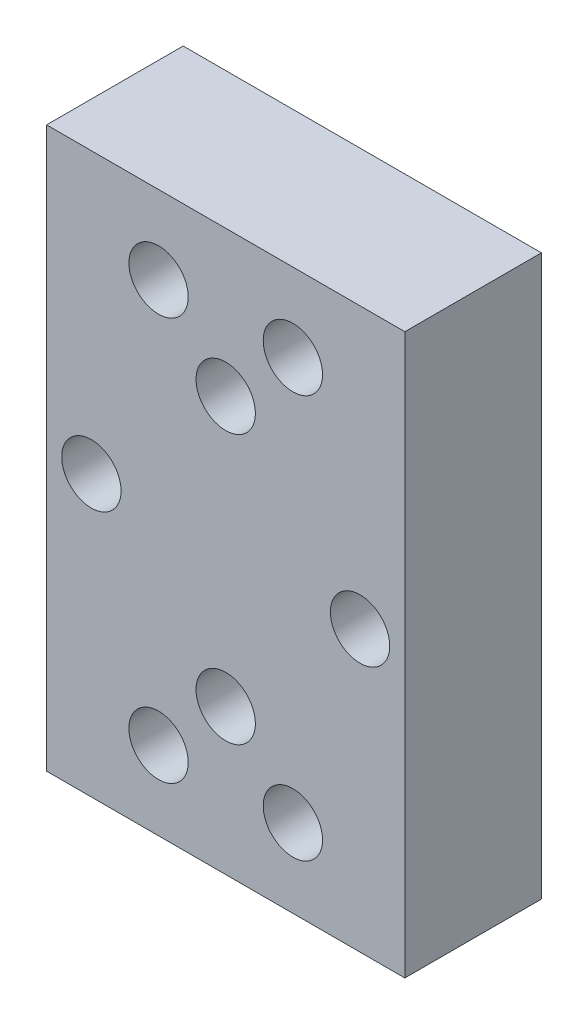
ISO-10303-21;
HEADER;
FILE_DESCRIPTION(('STEP AP214'),'2;1');
FILE_NAME('part.step','',(''),(''),'','','');
FILE_SCHEMA(('AUTOMOTIVE_DESIGN { 1 0 10303 214 1 1 1 1 }'));
ENDSEC;
DATA;
#1=APPLICATION_CONTEXT('core data for automotive mechanical design processes');
#2=APPLICATION_PROTOCOL_DEFINITION('international standard','automotive_design',2000,#1);
#3=PRODUCT_CONTEXT('',#1,'mechanical');
#4=PRODUCT('Part','Part','',(#3));
#5=PRODUCT_RELATED_PRODUCT_CATEGORY('part','',(#4));
#6=PRODUCT_DEFINITION_FORMATION('','',#4);
#7=PRODUCT_DEFINITION_CONTEXT('part definition',#1,'design');
#8=PRODUCT_DEFINITION('design','',#6,#7);
#9=PRODUCT_DEFINITION_SHAPE('','',#8);
#10=(LENGTH_UNIT() NAMED_UNIT(*) SI_UNIT(.MILLI.,.METRE.));
#11=(NAMED_UNIT(*) PLANE_ANGLE_UNIT() SI_UNIT($,.RADIAN.));
#12=(NAMED_UNIT(*) SI_UNIT($,.STERADIAN.) SOLID_ANGLE_UNIT());
#13=UNCERTAINTY_MEASURE_WITH_UNIT(LENGTH_MEASURE(1.E-05),#10,'distance_accuracy_value','');
#14=(GEOMETRIC_REPRESENTATION_CONTEXT(3) GLOBAL_UNCERTAINTY_ASSIGNED_CONTEXT((#13)) GLOBAL_UNIT_ASSIGNED_CONTEXT((#10,
#11,#12)) REPRESENTATION_CONTEXT('',''));
#15=CARTESIAN_POINT('',(0.,0.,0.));
#16=DIRECTION('',(0.,0.,1.));
#17=DIRECTION('',(1.,0.,0.));
#18=AXIS2_PLACEMENT_3D('',#15,#16,#17);
#19=CARTESIAN_POINT('',(0.,0.,6.1));
#20=DIRECTION('',(0.,0.,-1.));
#21=DIRECTION('',(-1.,0.,0.));
#22=AXIS2_PLACEMENT_3D('',#19,#20,#21);
#23=PLANE('',#22);
#24=DIRECTION('',(0.,-1.,0.));
#25=VECTOR('',#24,1.);
#26=CARTESIAN_POINT('',(0.,0.,6.1));
#27=LINE('',#26,#25);
#28=CARTESIAN_POINT('',(0.,25.,6.1));
#29=VERTEX_POINT('',#28);
#30=CARTESIAN_POINT('',(0.,0.,6.1));
#31=VERTEX_POINT('',#30);
#32=EDGE_CURVE('E98',#29,#31,#27,.T.);
#33=ORIENTED_EDGE('',*,*,#32,.T.);
#34=DIRECTION('',(1.,0.,0.));
#35=VECTOR('',#34,1.);
#36=CARTESIAN_POINT('',(0.,0.,6.1));
#37=LINE('',#36,#35);
#38=CARTESIAN_POINT('',(16.,0.,6.1));
#39=VERTEX_POINT('',#38);
#40=EDGE_CURVE('E93',#31,#39,#37,.T.);
#41=ORIENTED_EDGE('',*,*,#40,.T.);
#42=DIRECTION('',(0.,1.,0.));
#43=VECTOR('',#42,1.);
#44=CARTESIAN_POINT('',(16.,0.,6.1));
#45=LINE('',#44,#43);
#46=CARTESIAN_POINT('',(16.,25.,6.1));
#47=VERTEX_POINT('',#46);
#48=EDGE_CURVE('E96',#39,#47,#45,.T.);
#49=ORIENTED_EDGE('',*,*,#48,.T.);
#50=DIRECTION('',(-1.,0.,0.));
#51=VECTOR('',#50,1.);
#52=CARTESIAN_POINT('',(0.,25.,6.1));
#53=LINE('',#52,#51);
#54=EDGE_CURVE('E63',#47,#29,#53,.T.);
#55=ORIENTED_EDGE('',*,*,#54,.T.);
#56=EDGE_LOOP('',(#33,#41,#49,#55));
#57=FACE_BOUND('',#56,.T.);
#58=CARTESIAN_POINT('',(2.,12.5,6.1));
#59=DIRECTION('',(0.,0.,1.));
#60=DIRECTION('',(1.,0.,0.));
#61=AXIS2_PLACEMENT_3D('',#58,#59,#60);
#62=CIRCLE('',#61,1.325);
#63=CARTESIAN_POINT('',(3.325,12.5,6.1));
#64=VERTEX_POINT('',#63);
#65=EDGE_CURVE('E118',#64,#64,#62,.T.);
#66=ORIENTED_EDGE('',*,*,#65,.F.);
#67=EDGE_LOOP('',(#66));
#68=FACE_BOUND('',#67,.T.);
#69=CARTESIAN_POINT('',(8.,18.5,6.1));
#70=DIRECTION('',(0.,0.,1.));
#71=DIRECTION('',(1.,0.,0.));
#72=AXIS2_PLACEMENT_3D('',#69,#70,#71);
#73=CIRCLE('',#72,1.325);
#74=CARTESIAN_POINT('',(9.325,18.5,6.1));
#75=VERTEX_POINT('',#74);
#76=EDGE_CURVE('E140',#75,#75,#73,.T.);
#77=ORIENTED_EDGE('',*,*,#76,.F.);
#78=EDGE_LOOP('',(#77));
#79=FACE_BOUND('',#78,.T.);
#80=CARTESIAN_POINT('',(5.,21.5,6.1));
#81=DIRECTION('',(0.,0.,1.));
#82=DIRECTION('',(1.,0.,0.));
#83=AXIS2_PLACEMENT_3D('',#80,#81,#82);
#84=CIRCLE('',#83,1.325);
#85=CARTESIAN_POINT('',(6.325,21.5,6.1));
#86=VERTEX_POINT('',#85);
#87=EDGE_CURVE('E148',#86,#86,#84,.T.);
#88=ORIENTED_EDGE('',*,*,#87,.F.);
#89=EDGE_LOOP('',(#88));
#90=FACE_BOUND('',#89,.T.);
#91=CARTESIAN_POINT('',(14.,12.5,6.1));
#92=DIRECTION('',(0.,0.,1.));
#93=DIRECTION('',(-1.,0.,0.));
#94=AXIS2_PLACEMENT_3D('',#91,#92,#93);
#95=CIRCLE('',#94,1.325);
#96=CARTESIAN_POINT('',(12.675,12.5,6.1));
#97=VERTEX_POINT('',#96);
#98=EDGE_CURVE('E156',#97,#97,#95,.T.);
#99=ORIENTED_EDGE('',*,*,#98,.F.);
#100=EDGE_LOOP('',(#99));
#101=FACE_BOUND('',#100,.T.);
#102=CARTESIAN_POINT('',(11.,21.5,6.1));
#103=DIRECTION('',(0.,0.,1.));
#104=DIRECTION('',(-1.,0.,0.));
#105=AXIS2_PLACEMENT_3D('',#102,#103,#104);
#106=CIRCLE('',#105,1.325);
#107=CARTESIAN_POINT('',(9.675,21.5,6.1));
#108=VERTEX_POINT('',#107);
#109=EDGE_CURVE('E164',#108,#108,#106,.T.);
#110=ORIENTED_EDGE('',*,*,#109,.F.);
#111=EDGE_LOOP('',(#110));
#112=FACE_BOUND('',#111,.T.);
#113=CARTESIAN_POINT('',(5.,3.5,6.1));
#114=DIRECTION('',(0.,0.,1.));
#115=DIRECTION('',(-1.,0.,0.));
#116=AXIS2_PLACEMENT_3D('',#113,#114,#115);
#117=CIRCLE('',#116,1.325);
#118=CARTESIAN_POINT('',(3.675,3.5,6.1));
#119=VERTEX_POINT('',#118);
#120=EDGE_CURVE('E172',#119,#119,#117,.T.);
#121=ORIENTED_EDGE('',*,*,#120,.F.);
#122=EDGE_LOOP('',(#121));
#123=FACE_BOUND('',#122,.T.);
#124=CARTESIAN_POINT('',(11.,3.5,6.1));
#125=DIRECTION('',(0.,0.,1.));
#126=DIRECTION('',(1.,0.,0.));
#127=AXIS2_PLACEMENT_3D('',#124,#125,#126);
#128=CIRCLE('',#127,1.325);
#129=CARTESIAN_POINT('',(12.325,3.5,6.1));
#130=VERTEX_POINT('',#129);
#131=EDGE_CURVE('E180',#130,#130,#128,.T.);
#132=ORIENTED_EDGE('',*,*,#131,.F.);
#133=EDGE_LOOP('',(#132));
#134=FACE_BOUND('',#133,.T.);
#135=CARTESIAN_POINT('',(8.,6.5,6.1));
#136=DIRECTION('',(0.,0.,1.));
#137=DIRECTION('',(-1.,0.,0.));
#138=AXIS2_PLACEMENT_3D('',#135,#136,#137);
#139=CIRCLE('',#138,1.325);
#140=CARTESIAN_POINT('',(6.675,6.5,6.1));
#141=VERTEX_POINT('',#140);
#142=EDGE_CURVE('E188',#141,#141,#139,.T.);
#143=ORIENTED_EDGE('',*,*,#142,.F.);
#144=EDGE_LOOP('',(#143));
#145=FACE_BOUND('',#144,.T.);
#146=ADVANCED_FACE('F45',(#57,#68,#79,#90,#101,#112,#123,#134,#145),#23,.F.);
#147=CARTESIAN_POINT('',(0.,0.,0.));
#148=DIRECTION('',(0.,0.,-1.));
#149=DIRECTION('',(-1.,0.,0.));
#150=AXIS2_PLACEMENT_3D('',#147,#148,#149);
#151=PLANE('',#150);
#152=CARTESIAN_POINT('',(11.,3.5,0.));
#153=DIRECTION('',(0.,0.,1.));
#154=DIRECTION('',(1.,0.,0.));
#155=AXIS2_PLACEMENT_3D('',#152,#153,#154);
#156=CIRCLE('',#155,1.325);
#157=CARTESIAN_POINT('',(12.325,3.5,0.));
#158=VERTEX_POINT('',#157);
#159=EDGE_CURVE('E184',#158,#158,#156,.T.);
#160=ORIENTED_EDGE('',*,*,#159,.T.);
#161=EDGE_LOOP('',(#160));
#162=FACE_BOUND('',#161,.T.);
#163=CARTESIAN_POINT('',(11.,21.5,0.));
#164=DIRECTION('',(0.,0.,1.));
#165=DIRECTION('',(-1.,0.,0.));
#166=AXIS2_PLACEMENT_3D('',#163,#164,#165);
#167=CIRCLE('',#166,1.325);
#168=CARTESIAN_POINT('',(9.675,21.5,0.));
#169=VERTEX_POINT('',#168);
#170=EDGE_CURVE('E168',#169,#169,#167,.T.);
#171=ORIENTED_EDGE('',*,*,#170,.T.);
#172=EDGE_LOOP('',(#171));
#173=FACE_BOUND('',#172,.T.);
#174=CARTESIAN_POINT('',(5.,21.5,0.));
#175=DIRECTION('',(0.,0.,1.));
#176=DIRECTION('',(1.,0.,0.));
#177=AXIS2_PLACEMENT_3D('',#174,#175,#176);
#178=CIRCLE('',#177,1.325);
#179=CARTESIAN_POINT('',(6.325,21.5,0.));
#180=VERTEX_POINT('',#179);
#181=EDGE_CURVE('E152',#180,#180,#178,.T.);
#182=ORIENTED_EDGE('',*,*,#181,.T.);
#183=EDGE_LOOP('',(#182));
#184=FACE_BOUND('',#183,.T.);
#185=CARTESIAN_POINT('',(2.,12.5,0.));
#186=DIRECTION('',(0.,0.,1.));
#187=DIRECTION('',(1.,0.,0.));
#188=AXIS2_PLACEMENT_3D('',#185,#186,#187);
#189=CIRCLE('',#188,1.325);
#190=CARTESIAN_POINT('',(3.325,12.5,0.));
#191=VERTEX_POINT('',#190);
#192=EDGE_CURVE('E136',#191,#191,#189,.T.);
#193=ORIENTED_EDGE('',*,*,#192,.T.);
#194=EDGE_LOOP('',(#193));
#195=FACE_BOUND('',#194,.T.);
#196=DIRECTION('',(0.,-1.,0.));
#197=VECTOR('',#196,1.);
#198=CARTESIAN_POINT('',(0.,0.,0.));
#199=LINE('',#198,#197);
#200=CARTESIAN_POINT('',(0.,25.,0.));
#201=VERTEX_POINT('',#200);
#202=CARTESIAN_POINT('',(0.,0.,0.));
#203=VERTEX_POINT('',#202);
#204=EDGE_CURVE('E114',#201,#203,#199,.T.);
#205=ORIENTED_EDGE('',*,*,#204,.F.);
#206=DIRECTION('',(-1.,0.,0.));
#207=VECTOR('',#206,1.);
#208=CARTESIAN_POINT('',(0.,25.,0.));
#209=LINE('',#208,#207);
#210=CARTESIAN_POINT('',(16.,25.,0.));
#211=VERTEX_POINT('',#210);
#212=EDGE_CURVE('E86',#211,#201,#209,.T.);
#213=ORIENTED_EDGE('',*,*,#212,.F.);
#214=DIRECTION('',(0.,1.,0.));
#215=VECTOR('',#214,1.);
#216=CARTESIAN_POINT('',(16.,0.,0.));
#217=LINE('',#216,#215);
#218=CARTESIAN_POINT('',(16.,0.,0.));
#219=VERTEX_POINT('',#218);
#220=EDGE_CURVE('E80',#219,#211,#217,.T.);
#221=ORIENTED_EDGE('',*,*,#220,.F.);
#222=DIRECTION('',(1.,0.,0.));
#223=VECTOR('',#222,1.);
#224=CARTESIAN_POINT('',(0.,0.,0.));
#225=LINE('',#224,#223);
#226=EDGE_CURVE('E103',#203,#219,#225,.T.);
#227=ORIENTED_EDGE('',*,*,#226,.F.);
#228=EDGE_LOOP('',(#205,#213,#221,#227));
#229=FACE_BOUND('',#228,.T.);
#230=CARTESIAN_POINT('',(8.,18.5,0.));
#231=DIRECTION('',(0.,0.,1.));
#232=DIRECTION('',(1.,0.,0.));
#233=AXIS2_PLACEMENT_3D('',#230,#231,#232);
#234=CIRCLE('',#233,1.325);
#235=CARTESIAN_POINT('',(9.325,18.5,0.));
#236=VERTEX_POINT('',#235);
#237=EDGE_CURVE('E144',#236,#236,#234,.T.);
#238=ORIENTED_EDGE('',*,*,#237,.T.);
#239=EDGE_LOOP('',(#238));
#240=FACE_BOUND('',#239,.T.);
#241=CARTESIAN_POINT('',(14.,12.5,0.));
#242=DIRECTION('',(0.,0.,1.));
#243=DIRECTION('',(-1.,0.,0.));
#244=AXIS2_PLACEMENT_3D('',#241,#242,#243);
#245=CIRCLE('',#244,1.325);
#246=CARTESIAN_POINT('',(12.675,12.5,0.));
#247=VERTEX_POINT('',#246);
#248=EDGE_CURVE('E160',#247,#247,#245,.T.);
#249=ORIENTED_EDGE('',*,*,#248,.T.);
#250=EDGE_LOOP('',(#249));
#251=FACE_BOUND('',#250,.T.);
#252=CARTESIAN_POINT('',(5.,3.5,0.));
#253=DIRECTION('',(0.,0.,1.));
#254=DIRECTION('',(-1.,0.,0.));
#255=AXIS2_PLACEMENT_3D('',#252,#253,#254);
#256=CIRCLE('',#255,1.325);
#257=CARTESIAN_POINT('',(3.675,3.5,0.));
#258=VERTEX_POINT('',#257);
#259=EDGE_CURVE('E176',#258,#258,#256,.T.);
#260=ORIENTED_EDGE('',*,*,#259,.T.);
#261=EDGE_LOOP('',(#260));
#262=FACE_BOUND('',#261,.T.);
#263=CARTESIAN_POINT('',(8.,6.5,0.));
#264=DIRECTION('',(0.,0.,1.));
#265=DIRECTION('',(-1.,0.,0.));
#266=AXIS2_PLACEMENT_3D('',#263,#264,#265);
#267=CIRCLE('',#266,1.325);
#268=CARTESIAN_POINT('',(6.675,6.5,0.));
#269=VERTEX_POINT('',#268);
#270=EDGE_CURVE('E192',#269,#269,#267,.T.);
#271=ORIENTED_EDGE('',*,*,#270,.T.);
#272=EDGE_LOOP('',(#271));
#273=FACE_BOUND('',#272,.T.);
#274=ADVANCED_FACE('F131',(#162,#173,#184,#195,#229,#240,#251,#262,#273),#151,.T.);
#275=CARTESIAN_POINT('',(0.,0.,6.1));
#276=DIRECTION('',(1.,0.,0.));
#277=DIRECTION('',(0.,0.,-1.));
#278=AXIS2_PLACEMENT_3D('',#275,#276,#277);
#279=PLANE('',#278);
#280=ORIENTED_EDGE('',*,*,#204,.T.);
#281=DIRECTION('',(0.,0.,-1.));
#282=VECTOR('',#281,1.);
#283=CARTESIAN_POINT('',(0.,0.,6.1));
#284=LINE('',#283,#282);
#285=EDGE_CURVE('E11',#31,#203,#284,.T.);
#286=ORIENTED_EDGE('',*,*,#285,.F.);
#287=ORIENTED_EDGE('',*,*,#32,.F.);
#288=DIRECTION('',(0.,0.,-1.));
#289=VECTOR('',#288,1.);
#290=CARTESIAN_POINT('',(0.,25.,6.1));
#291=LINE('',#290,#289);
#292=EDGE_CURVE('E110',#29,#201,#291,.T.);
#293=ORIENTED_EDGE('',*,*,#292,.T.);
#294=EDGE_LOOP('',(#280,#286,#287,#293));
#295=FACE_BOUND('',#294,.T.);
#296=ADVANCED_FACE('F47',(#295),#279,.F.);
#297=CARTESIAN_POINT('',(0.,0.,6.1));
#298=DIRECTION('',(0.,1.,0.));
#299=DIRECTION('',(0.,0.,1.));
#300=AXIS2_PLACEMENT_3D('',#297,#298,#299);
#301=PLANE('',#300);
#302=ORIENTED_EDGE('',*,*,#226,.T.);
#303=DIRECTION('',(0.,0.,-1.));
#304=VECTOR('',#303,1.);
#305=CARTESIAN_POINT('',(16.,0.,6.1));
#306=LINE('',#305,#304);
#307=EDGE_CURVE('E55',#39,#219,#306,.T.);
#308=ORIENTED_EDGE('',*,*,#307,.F.);
#309=ORIENTED_EDGE('',*,*,#40,.F.);
#310=ORIENTED_EDGE('',*,*,#285,.T.);
#311=EDGE_LOOP('',(#302,#308,#309,#310));
#312=FACE_BOUND('',#311,.T.);
#313=ADVANCED_FACE('F102',(#312),#301,.F.);
#314=CARTESIAN_POINT('',(16.,0.,6.1));
#315=DIRECTION('',(-1.,0.,0.));
#316=DIRECTION('',(0.,0.,1.));
#317=AXIS2_PLACEMENT_3D('',#314,#315,#316);
#318=PLANE('',#317);
#319=ORIENTED_EDGE('',*,*,#220,.T.);
#320=DIRECTION('',(0.,0.,-1.));
#321=VECTOR('',#320,1.);
#322=CARTESIAN_POINT('',(16.,25.,6.1));
#323=LINE('',#322,#321);
#324=EDGE_CURVE('E105',#47,#211,#323,.T.);
#325=ORIENTED_EDGE('',*,*,#324,.F.);
#326=ORIENTED_EDGE('',*,*,#48,.F.);
#327=ORIENTED_EDGE('',*,*,#307,.T.);
#328=EDGE_LOOP('',(#319,#325,#326,#327));
#329=FACE_BOUND('',#328,.T.);
#330=ADVANCED_FACE('F106',(#329),#318,.F.);
#331=CARTESIAN_POINT('',(0.,25.,6.1));
#332=DIRECTION('',(0.,-1.,0.));
#333=DIRECTION('',(0.,0.,-1.));
#334=AXIS2_PLACEMENT_3D('',#331,#332,#333);
#335=PLANE('',#334);
#336=ORIENTED_EDGE('',*,*,#212,.T.);
#337=ORIENTED_EDGE('',*,*,#292,.F.);
#338=ORIENTED_EDGE('',*,*,#54,.F.);
#339=ORIENTED_EDGE('',*,*,#324,.T.);
#340=EDGE_LOOP('',(#336,#337,#338,#339));
#341=FACE_BOUND('',#340,.T.);
#342=ADVANCED_FACE('F128',(#341),#335,.F.);
#343=CARTESIAN_POINT('',(2.,12.5,6.1));
#344=DIRECTION('',(0.,0.,-1.));
#345=DIRECTION('',(-1.,0.,0.));
#346=AXIS2_PLACEMENT_3D('',#343,#344,#345);
#347=CYLINDRICAL_SURFACE('',#346,1.325);
#348=ORIENTED_EDGE('',*,*,#65,.T.);
#349=EDGE_LOOP('',(#348));
#350=FACE_BOUND('',#349,.T.);
#351=ORIENTED_EDGE('',*,*,#192,.F.);
#352=EDGE_LOOP('',(#351));
#353=FACE_BOUND('',#352,.T.);
#354=ADVANCED_FACE('F211',(#350,#353),#347,.F.);
#355=CARTESIAN_POINT('',(8.,18.5,6.1));
#356=DIRECTION('',(0.,0.,-1.));
#357=DIRECTION('',(-1.,0.,0.));
#358=AXIS2_PLACEMENT_3D('',#355,#356,#357);
#359=CYLINDRICAL_SURFACE('',#358,1.325);
#360=ORIENTED_EDGE('',*,*,#76,.T.);
#361=EDGE_LOOP('',(#360));
#362=FACE_BOUND('',#361,.T.);
#363=ORIENTED_EDGE('',*,*,#237,.F.);
#364=EDGE_LOOP('',(#363));
#365=FACE_BOUND('',#364,.T.);
#366=ADVANCED_FACE('F279',(#362,#365),#359,.F.);
#367=CARTESIAN_POINT('',(5.,21.5,6.1));
#368=DIRECTION('',(0.,0.,-1.));
#369=DIRECTION('',(-1.,0.,0.));
#370=AXIS2_PLACEMENT_3D('',#367,#368,#369);
#371=CYLINDRICAL_SURFACE('',#370,1.325);
#372=ORIENTED_EDGE('',*,*,#87,.T.);
#373=EDGE_LOOP('',(#372));
#374=FACE_BOUND('',#373,.T.);
#375=ORIENTED_EDGE('',*,*,#181,.F.);
#376=EDGE_LOOP('',(#375));
#377=FACE_BOUND('',#376,.T.);
#378=ADVANCED_FACE('F290',(#374,#377),#371,.F.);
#379=CARTESIAN_POINT('',(14.,12.5,6.1));
#380=DIRECTION('',(0.,0.,-1.));
#381=DIRECTION('',(-1.,0.,0.));
#382=AXIS2_PLACEMENT_3D('',#379,#380,#381);
#383=CYLINDRICAL_SURFACE('',#382,1.325);
#384=ORIENTED_EDGE('',*,*,#98,.T.);
#385=EDGE_LOOP('',(#384));
#386=FACE_BOUND('',#385,.T.);
#387=ORIENTED_EDGE('',*,*,#248,.F.);
#388=EDGE_LOOP('',(#387));
#389=FACE_BOUND('',#388,.T.);
#390=ADVANCED_FACE('F301',(#386,#389),#383,.F.);
#391=CARTESIAN_POINT('',(11.,21.5,6.1));
#392=DIRECTION('',(0.,0.,-1.));
#393=DIRECTION('',(-1.,0.,0.));
#394=AXIS2_PLACEMENT_3D('',#391,#392,#393);
#395=CYLINDRICAL_SURFACE('',#394,1.325);
#396=ORIENTED_EDGE('',*,*,#109,.T.);
#397=EDGE_LOOP('',(#396));
#398=FACE_BOUND('',#397,.T.);
#399=ORIENTED_EDGE('',*,*,#170,.F.);
#400=EDGE_LOOP('',(#399));
#401=FACE_BOUND('',#400,.T.);
#402=ADVANCED_FACE('F313',(#398,#401),#395,.F.);
#403=CARTESIAN_POINT('',(5.,3.5,6.1));
#404=DIRECTION('',(0.,0.,-1.));
#405=DIRECTION('',(-1.,0.,0.));
#406=AXIS2_PLACEMENT_3D('',#403,#404,#405);
#407=CYLINDRICAL_SURFACE('',#406,1.325);
#408=ORIENTED_EDGE('',*,*,#120,.T.);
#409=EDGE_LOOP('',(#408));
#410=FACE_BOUND('',#409,.T.);
#411=ORIENTED_EDGE('',*,*,#259,.F.);
#412=EDGE_LOOP('',(#411));
#413=FACE_BOUND('',#412,.T.);
#414=ADVANCED_FACE('F325',(#410,#413),#407,.F.);
#415=CARTESIAN_POINT('',(11.,3.5,6.1));
#416=DIRECTION('',(0.,0.,-1.));
#417=DIRECTION('',(-1.,0.,0.));
#418=AXIS2_PLACEMENT_3D('',#415,#416,#417);
#419=CYLINDRICAL_SURFACE('',#418,1.325);
#420=ORIENTED_EDGE('',*,*,#131,.T.);
#421=EDGE_LOOP('',(#420));
#422=FACE_BOUND('',#421,.T.);
#423=ORIENTED_EDGE('',*,*,#159,.F.);
#424=EDGE_LOOP('',(#423));
#425=FACE_BOUND('',#424,.T.);
#426=ADVANCED_FACE('F337',(#422,#425),#419,.F.);
#427=CARTESIAN_POINT('',(8.,6.5,6.1));
#428=DIRECTION('',(0.,0.,-1.));
#429=DIRECTION('',(-1.,0.,0.));
#430=AXIS2_PLACEMENT_3D('',#427,#428,#429);
#431=CYLINDRICAL_SURFACE('',#430,1.325);
#432=ORIENTED_EDGE('',*,*,#142,.T.);
#433=EDGE_LOOP('',(#432));
#434=FACE_BOUND('',#433,.T.);
#435=ORIENTED_EDGE('',*,*,#270,.F.);
#436=EDGE_LOOP('',(#435));
#437=FACE_BOUND('',#436,.T.);
#438=ADVANCED_FACE('F200',(#434,#437),#431,.F.);
#439=CLOSED_SHELL('',(#146,#274,#296,#313,#330,#342,#354,#366,#378,#390,#402,#414,#426,#438));
#440=MANIFOLD_SOLID_BREP('B2',#439);
#441=ADVANCED_BREP_SHAPE_REPRESENTATION('',(#18,#440),#14);
#442=SHAPE_DEFINITION_REPRESENTATION(#9,#441);
ENDSEC;
END-ISO-10303-21;
